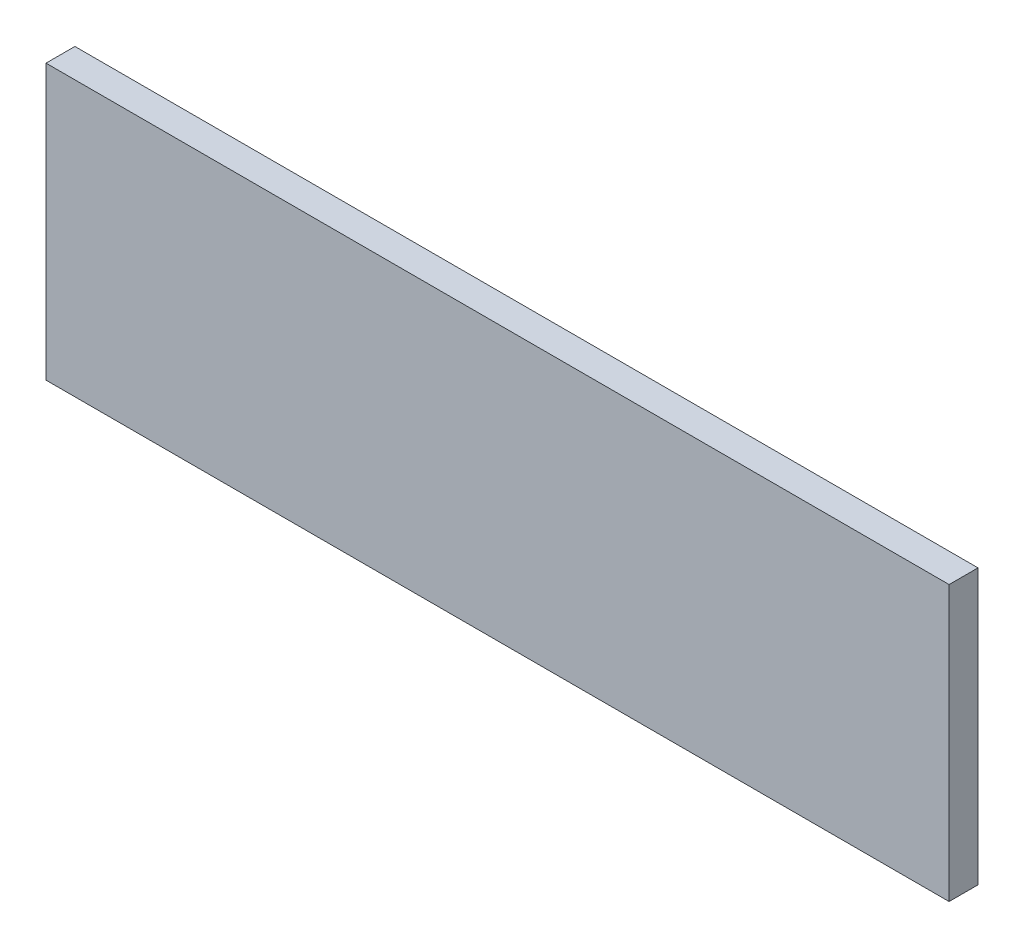
ISO-10303-21;
HEADER;
FILE_DESCRIPTION(('STEP AP214'),'2;1');
FILE_NAME('part.step','',(''),(''),'','','');
FILE_SCHEMA(('AUTOMOTIVE_DESIGN { 1 0 10303 214 1 1 1 1 }'));
ENDSEC;
DATA;
#1=APPLICATION_CONTEXT('core data for automotive mechanical design processes');
#2=APPLICATION_PROTOCOL_DEFINITION('international standard','automotive_design',2000,#1);
#3=PRODUCT_CONTEXT('',#1,'mechanical');
#4=PRODUCT('Part','Part','',(#3));
#5=PRODUCT_RELATED_PRODUCT_CATEGORY('part','',(#4));
#6=PRODUCT_DEFINITION_FORMATION('','',#4);
#7=PRODUCT_DEFINITION_CONTEXT('part definition',#1,'design');
#8=PRODUCT_DEFINITION('design','',#6,#7);
#9=PRODUCT_DEFINITION_SHAPE('','',#8);
#10=(LENGTH_UNIT() NAMED_UNIT(*) SI_UNIT(.MILLI.,.METRE.));
#11=(NAMED_UNIT(*) PLANE_ANGLE_UNIT() SI_UNIT($,.RADIAN.));
#12=(NAMED_UNIT(*) SI_UNIT($,.STERADIAN.) SOLID_ANGLE_UNIT());
#13=UNCERTAINTY_MEASURE_WITH_UNIT(LENGTH_MEASURE(1.E-05),#10,'distance_accuracy_value','');
#14=(GEOMETRIC_REPRESENTATION_CONTEXT(3) GLOBAL_UNCERTAINTY_ASSIGNED_CONTEXT((#13)) GLOBAL_UNIT_ASSIGNED_CONTEXT((#10,
#11,#12)) REPRESENTATION_CONTEXT('',''));
#15=CARTESIAN_POINT('',(0.,0.,0.));
#16=DIRECTION('',(0.,0.,1.));
#17=DIRECTION('',(1.,0.,0.));
#18=AXIS2_PLACEMENT_3D('',#15,#16,#17);
#19=CARTESIAN_POINT('',(-125.,-38.,8.));
#20=DIRECTION('',(1.,0.,0.));
#21=DIRECTION('',(0.,0.,-1.));
#22=AXIS2_PLACEMENT_3D('',#19,#20,#21);
#23=PLANE('',#22);
#24=DIRECTION('',(0.,-1.,0.));
#25=VECTOR('',#24,1.);
#26=CARTESIAN_POINT('',(-125.,-38.,0.));
#27=LINE('',#26,#25);
#28=CARTESIAN_POINT('',(-125.,38.,0.));
#29=VERTEX_POINT('',#28);
#30=CARTESIAN_POINT('',(-125.,-38.,0.));
#31=VERTEX_POINT('',#30);
#32=EDGE_CURVE('E96',#29,#31,#27,.T.);
#33=ORIENTED_EDGE('',*,*,#32,.T.);
#34=DIRECTION('',(0.,0.,-1.));
#35=VECTOR('',#34,1.);
#36=CARTESIAN_POINT('',(-125.,-38.,8.));
#37=LINE('',#36,#35);
#38=CARTESIAN_POINT('',(-125.,-38.,8.));
#39=VERTEX_POINT('',#38);
#40=EDGE_CURVE('E11',#39,#31,#37,.T.);
#41=ORIENTED_EDGE('',*,*,#40,.F.);
#42=DIRECTION('',(0.,-1.,0.));
#43=VECTOR('',#42,1.);
#44=CARTESIAN_POINT('',(-125.,-38.,8.));
#45=LINE('',#44,#43);
#46=CARTESIAN_POINT('',(-125.,38.,8.));
#47=VERTEX_POINT('',#46);
#48=EDGE_CURVE('E84',#47,#39,#45,.T.);
#49=ORIENTED_EDGE('',*,*,#48,.F.);
#50=DIRECTION('',(0.,0.,-1.));
#51=VECTOR('',#50,1.);
#52=CARTESIAN_POINT('',(-125.,38.,8.));
#53=LINE('',#52,#51);
#54=EDGE_CURVE('E92',#47,#29,#53,.T.);
#55=ORIENTED_EDGE('',*,*,#54,.T.);
#56=EDGE_LOOP('',(#33,#41,#49,#55));
#57=FACE_BOUND('',#56,.T.);
#58=ADVANCED_FACE('F33',(#57),#23,.F.);
#59=CARTESIAN_POINT('',(-125.,-38.,8.));
#60=DIRECTION('',(0.,1.,0.));
#61=DIRECTION('',(0.,0.,1.));
#62=AXIS2_PLACEMENT_3D('',#59,#60,#61);
#63=PLANE('',#62);
#64=DIRECTION('',(1.,0.,0.));
#65=VECTOR('',#64,1.);
#66=CARTESIAN_POINT('',(-125.,-38.,0.));
#67=LINE('',#66,#65);
#68=CARTESIAN_POINT('',(125.,-38.,0.));
#69=VERTEX_POINT('',#68);
#70=EDGE_CURVE('E88',#31,#69,#67,.T.);
#71=ORIENTED_EDGE('',*,*,#70,.T.);
#72=DIRECTION('',(0.,0.,-1.));
#73=VECTOR('',#72,1.);
#74=CARTESIAN_POINT('',(125.,-38.,8.));
#75=LINE('',#74,#73);
#76=CARTESIAN_POINT('',(125.,-38.,8.));
#77=VERTEX_POINT('',#76);
#78=EDGE_CURVE('E41',#77,#69,#75,.T.);
#79=ORIENTED_EDGE('',*,*,#78,.F.);
#80=DIRECTION('',(1.,0.,0.));
#81=VECTOR('',#80,1.);
#82=CARTESIAN_POINT('',(-125.,-38.,8.));
#83=LINE('',#82,#81);
#84=EDGE_CURVE('E79',#39,#77,#83,.T.);
#85=ORIENTED_EDGE('',*,*,#84,.F.);
#86=ORIENTED_EDGE('',*,*,#40,.T.);
#87=EDGE_LOOP('',(#71,#79,#85,#86));
#88=FACE_BOUND('',#87,.T.);
#89=ADVANCED_FACE('F87',(#88),#63,.F.);
#90=CARTESIAN_POINT('',(125.,-38.,8.));
#91=DIRECTION('',(-1.,0.,0.));
#92=DIRECTION('',(0.,0.,1.));
#93=AXIS2_PLACEMENT_3D('',#90,#91,#92);
#94=PLANE('',#93);
#95=DIRECTION('',(0.,1.,0.));
#96=VECTOR('',#95,1.);
#97=CARTESIAN_POINT('',(125.,-38.,0.));
#98=LINE('',#97,#96);
#99=CARTESIAN_POINT('',(125.,38.,0.));
#100=VERTEX_POINT('',#99);
#101=EDGE_CURVE('E66',#69,#100,#98,.T.);
#102=ORIENTED_EDGE('',*,*,#101,.T.);
#103=DIRECTION('',(0.,0.,-1.));
#104=VECTOR('',#103,1.);
#105=CARTESIAN_POINT('',(125.,38.,8.));
#106=LINE('',#105,#104);
#107=CARTESIAN_POINT('',(125.,38.,8.));
#108=VERTEX_POINT('',#107);
#109=EDGE_CURVE('E89',#108,#100,#106,.T.);
#110=ORIENTED_EDGE('',*,*,#109,.F.);
#111=DIRECTION('',(0.,1.,0.));
#112=VECTOR('',#111,1.);
#113=CARTESIAN_POINT('',(125.,-38.,8.));
#114=LINE('',#113,#112);
#115=EDGE_CURVE('E82',#77,#108,#114,.T.);
#116=ORIENTED_EDGE('',*,*,#115,.F.);
#117=ORIENTED_EDGE('',*,*,#78,.T.);
#118=EDGE_LOOP('',(#102,#110,#116,#117));
#119=FACE_BOUND('',#118,.T.);
#120=ADVANCED_FACE('F90',(#119),#94,.F.);
#121=CARTESIAN_POINT('',(-125.,38.,8.));
#122=DIRECTION('',(0.,-1.,0.));
#123=DIRECTION('',(0.,0.,-1.));
#124=AXIS2_PLACEMENT_3D('',#121,#122,#123);
#125=PLANE('',#124);
#126=DIRECTION('',(-1.,0.,0.));
#127=VECTOR('',#126,1.);
#128=CARTESIAN_POINT('',(-125.,38.,0.));
#129=LINE('',#128,#127);
#130=EDGE_CURVE('E72',#100,#29,#129,.T.);
#131=ORIENTED_EDGE('',*,*,#130,.T.);
#132=ORIENTED_EDGE('',*,*,#54,.F.);
#133=DIRECTION('',(-1.,0.,0.));
#134=VECTOR('',#133,1.);
#135=CARTESIAN_POINT('',(-125.,38.,8.));
#136=LINE('',#135,#134);
#137=EDGE_CURVE('E49',#108,#47,#136,.T.);
#138=ORIENTED_EDGE('',*,*,#137,.F.);
#139=ORIENTED_EDGE('',*,*,#109,.T.);
#140=EDGE_LOOP('',(#131,#132,#138,#139));
#141=FACE_BOUND('',#140,.T.);
#142=ADVANCED_FACE('F103',(#141),#125,.F.);
#143=CARTESIAN_POINT('',(0.,0.,8.));
#144=DIRECTION('',(0.,0.,-1.));
#145=DIRECTION('',(-1.,0.,0.));
#146=AXIS2_PLACEMENT_3D('',#143,#144,#145);
#147=PLANE('',#146);
#148=ORIENTED_EDGE('',*,*,#48,.T.);
#149=ORIENTED_EDGE('',*,*,#84,.T.);
#150=ORIENTED_EDGE('',*,*,#115,.T.);
#151=ORIENTED_EDGE('',*,*,#137,.T.);
#152=EDGE_LOOP('',(#148,#149,#150,#151));
#153=FACE_BOUND('',#152,.T.);
#154=ADVANCED_FACE('F80',(#153),#147,.F.);
#155=CARTESIAN_POINT('',(0.,0.,0.));
#156=DIRECTION('',(0.,0.,-1.));
#157=DIRECTION('',(-1.,0.,0.));
#158=AXIS2_PLACEMENT_3D('',#155,#156,#157);
#159=PLANE('',#158);
#160=ORIENTED_EDGE('',*,*,#32,.F.);
#161=ORIENTED_EDGE('',*,*,#130,.F.);
#162=ORIENTED_EDGE('',*,*,#101,.F.);
#163=ORIENTED_EDGE('',*,*,#70,.F.);
#164=EDGE_LOOP('',(#160,#161,#162,#163));
#165=FACE_BOUND('',#164,.T.);
#166=ADVANCED_FACE('F106',(#165),#159,.T.);
#167=CLOSED_SHELL('',(#58,#89,#120,#142,#154,#166));
#168=MANIFOLD_SOLID_BREP('B2',#167);
#169=ADVANCED_BREP_SHAPE_REPRESENTATION('',(#18,#168),#14);
#170=SHAPE_DEFINITION_REPRESENTATION(#9,#169);
ENDSEC;
END-ISO-10303-21;
